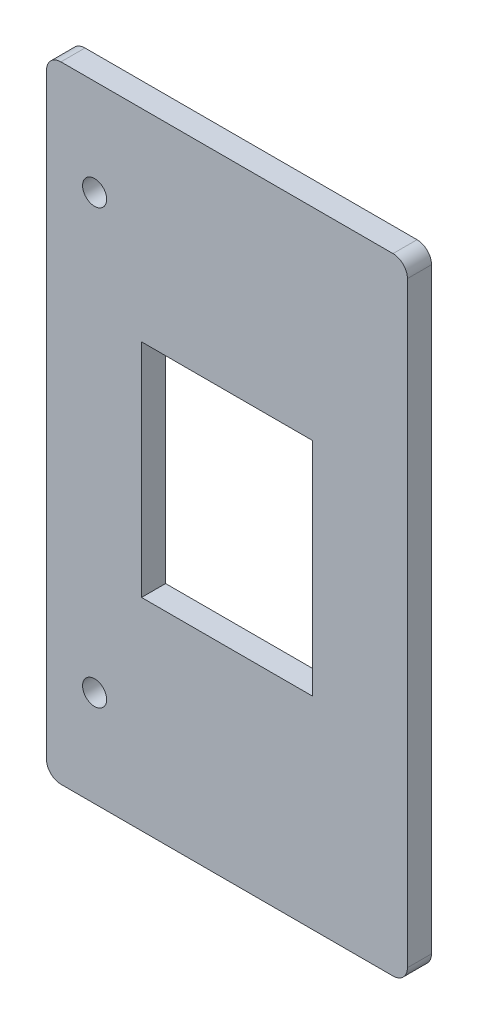
ISO-10303-21;
HEADER;
FILE_DESCRIPTION(('STEP AP214'),'2;1');
FILE_NAME('part.step','',(''),(''),'','','');
FILE_SCHEMA(('AUTOMOTIVE_DESIGN { 1 0 10303 214 1 1 1 1 }'));
ENDSEC;
DATA;
#1=APPLICATION_CONTEXT('core data for automotive mechanical design processes');
#2=APPLICATION_PROTOCOL_DEFINITION('international standard','automotive_design',2000,#1);
#3=PRODUCT_CONTEXT('',#1,'mechanical');
#4=PRODUCT('Part','Part','',(#3));
#5=PRODUCT_RELATED_PRODUCT_CATEGORY('part','',(#4));
#6=PRODUCT_DEFINITION_FORMATION('','',#4);
#7=PRODUCT_DEFINITION_CONTEXT('part definition',#1,'design');
#8=PRODUCT_DEFINITION('design','',#6,#7);
#9=PRODUCT_DEFINITION_SHAPE('','',#8);
#10=(LENGTH_UNIT() NAMED_UNIT(*) SI_UNIT(.MILLI.,.METRE.));
#11=(NAMED_UNIT(*) PLANE_ANGLE_UNIT() SI_UNIT($,.RADIAN.));
#12=(NAMED_UNIT(*) SI_UNIT($,.STERADIAN.) SOLID_ANGLE_UNIT());
#13=UNCERTAINTY_MEASURE_WITH_UNIT(LENGTH_MEASURE(1.E-05),#10,'distance_accuracy_value','');
#14=(GEOMETRIC_REPRESENTATION_CONTEXT(3) GLOBAL_UNCERTAINTY_ASSIGNED_CONTEXT((#13)) GLOBAL_UNIT_ASSIGNED_CONTEXT((#10,
#11,#12)) REPRESENTATION_CONTEXT('',''));
#15=CARTESIAN_POINT('',(0.,0.,0.));
#16=DIRECTION('',(0.,0.,1.));
#17=DIRECTION('',(1.,0.,0.));
#18=AXIS2_PLACEMENT_3D('',#15,#16,#17);
#19=CARTESIAN_POINT('',(0.,0.,5.));
#20=DIRECTION('',(0.,0.,1.));
#21=DIRECTION('',(1.,0.,0.));
#22=AXIS2_PLACEMENT_3D('',#19,#20,#21);
#23=PLANE('',#22);
#24=DIRECTION('',(1.,0.,0.));
#25=VECTOR('',#24,1.);
#26=CARTESIAN_POINT('',(-37.5,-65.,5.));
#27=LINE('',#26,#25);
#28=CARTESIAN_POINT('',(-34.5,-65.,5.));
#29=VERTEX_POINT('',#28);
#30=CARTESIAN_POINT('',(34.5,-65.,5.));
#31=VERTEX_POINT('',#30);
#32=EDGE_CURVE('E173',#29,#31,#27,.T.);
#33=ORIENTED_EDGE('',*,*,#32,.T.);
#34=CARTESIAN_POINT('',(34.5,-62.,5.));
#35=DIRECTION('',(0.,0.,1.));
#36=DIRECTION('',(1.,0.,0.));
#37=AXIS2_PLACEMENT_3D('',#34,#35,#36);
#38=CIRCLE('',#37,3.);
#39=CARTESIAN_POINT('',(37.5,-62.,5.));
#40=VERTEX_POINT('',#39);
#41=EDGE_CURVE('E222',#31,#40,#38,.T.);
#42=ORIENTED_EDGE('',*,*,#41,.T.);
#43=DIRECTION('',(0.,1.,0.));
#44=VECTOR('',#43,1.);
#45=CARTESIAN_POINT('',(37.5,65.,5.));
#46=LINE('',#45,#44);
#47=CARTESIAN_POINT('',(37.5,62.,5.));
#48=VERTEX_POINT('',#47);
#49=EDGE_CURVE('E165',#40,#48,#46,.T.);
#50=ORIENTED_EDGE('',*,*,#49,.T.);
#51=CARTESIAN_POINT('',(34.5,62.,5.));
#52=DIRECTION('',(0.,0.,1.));
#53=DIRECTION('',(1.,0.,0.));
#54=AXIS2_PLACEMENT_3D('',#51,#52,#53);
#55=CIRCLE('',#54,3.);
#56=CARTESIAN_POINT('',(34.5,65.,5.));
#57=VERTEX_POINT('',#56);
#58=EDGE_CURVE('E217',#48,#57,#55,.T.);
#59=ORIENTED_EDGE('',*,*,#58,.T.);
#60=DIRECTION('',(-1.,0.,0.));
#61=VECTOR('',#60,1.);
#62=CARTESIAN_POINT('',(-37.5,65.,5.));
#63=LINE('',#62,#61);
#64=CARTESIAN_POINT('',(-34.5,65.,5.));
#65=VERTEX_POINT('',#64);
#66=EDGE_CURVE('E168',#57,#65,#63,.T.);
#67=ORIENTED_EDGE('',*,*,#66,.T.);
#68=CARTESIAN_POINT('',(-34.5,62.,5.));
#69=DIRECTION('',(0.,0.,1.));
#70=DIRECTION('',(1.,0.,0.));
#71=AXIS2_PLACEMENT_3D('',#68,#69,#70);
#72=CIRCLE('',#71,3.);
#73=CARTESIAN_POINT('',(-37.5,62.,5.));
#74=VERTEX_POINT('',#73);
#75=EDGE_CURVE('E57',#65,#74,#72,.T.);
#76=ORIENTED_EDGE('',*,*,#75,.T.);
#77=DIRECTION('',(0.,-1.,0.));
#78=VECTOR('',#77,1.);
#79=CARTESIAN_POINT('',(-37.5,65.,5.));
#80=LINE('',#79,#78);
#81=CARTESIAN_POINT('',(-37.5,-62.,5.));
#82=VERTEX_POINT('',#81);
#83=EDGE_CURVE('E171',#74,#82,#80,.T.);
#84=ORIENTED_EDGE('',*,*,#83,.T.);
#85=CARTESIAN_POINT('',(-34.5,-62.,5.));
#86=DIRECTION('',(0.,0.,1.));
#87=DIRECTION('',(1.,0.,0.));
#88=AXIS2_PLACEMENT_3D('',#85,#86,#87);
#89=CIRCLE('',#88,3.);
#90=EDGE_CURVE('E220',#82,#29,#89,.T.);
#91=ORIENTED_EDGE('',*,*,#90,.T.);
#92=EDGE_LOOP('',(#33,#42,#50,#59,#67,#76,#84,#91));
#93=FACE_BOUND('',#92,.T.);
#94=CARTESIAN_POINT('',(-27.5,45.,5.));
#95=DIRECTION('',(0.,0.,1.));
#96=DIRECTION('',(1.,0.,0.));
#97=AXIS2_PLACEMENT_3D('',#94,#95,#96);
#98=CIRCLE('',#97,2.5);
#99=CARTESIAN_POINT('',(-25.,45.,5.));
#100=VERTEX_POINT('',#99);
#101=EDGE_CURVE('E162',#100,#100,#98,.T.);
#102=ORIENTED_EDGE('',*,*,#101,.F.);
#103=EDGE_LOOP('',(#102));
#104=FACE_BOUND('',#103,.T.);
#105=CARTESIAN_POINT('',(-27.5,-45.,5.));
#106=DIRECTION('',(0.,0.,1.));
#107=DIRECTION('',(1.,0.,0.));
#108=AXIS2_PLACEMENT_3D('',#105,#106,#107);
#109=CIRCLE('',#108,2.5);
#110=CARTESIAN_POINT('',(-25.,-45.,5.));
#111=VERTEX_POINT('',#110);
#112=EDGE_CURVE('E159',#111,#111,#109,.F.);
#113=ORIENTED_EDGE('',*,*,#112,.T.);
#114=EDGE_LOOP('',(#113));
#115=FACE_BOUND('',#114,.T.);
#116=DIRECTION('',(1.,0.,0.));
#117=VECTOR('',#116,1.);
#118=CARTESIAN_POINT('',(0.,23.,5.));
#119=LINE('',#118,#117);
#120=CARTESIAN_POINT('',(-17.75,23.,5.));
#121=VERTEX_POINT('',#120);
#122=CARTESIAN_POINT('',(17.75,23.,5.));
#123=VERTEX_POINT('',#122);
#124=EDGE_CURVE('E141',#121,#123,#119,.T.);
#125=ORIENTED_EDGE('',*,*,#124,.T.);
#126=DIRECTION('',(0.,-1.,0.));
#127=VECTOR('',#126,1.);
#128=CARTESIAN_POINT('',(17.75,0.,5.));
#129=LINE('',#128,#127);
#130=CARTESIAN_POINT('',(17.75,-23.,5.));
#131=VERTEX_POINT('',#130);
#132=EDGE_CURVE('E146',#123,#131,#129,.T.);
#133=ORIENTED_EDGE('',*,*,#132,.T.);
#134=DIRECTION('',(1.,0.,0.));
#135=VECTOR('',#134,1.);
#136=CARTESIAN_POINT('',(0.,-23.,5.));
#137=LINE('',#136,#135);
#138=CARTESIAN_POINT('',(-17.75,-23.,5.));
#139=VERTEX_POINT('',#138);
#140=EDGE_CURVE('E149',#139,#131,#137,.T.);
#141=ORIENTED_EDGE('',*,*,#140,.F.);
#142=DIRECTION('',(0.,-1.,0.));
#143=VECTOR('',#142,1.);
#144=CARTESIAN_POINT('',(-17.75,0.,5.));
#145=LINE('',#144,#143);
#146=EDGE_CURVE('E130',#121,#139,#145,.T.);
#147=ORIENTED_EDGE('',*,*,#146,.F.);
#148=EDGE_LOOP('',(#125,#133,#141,#147));
#149=FACE_BOUND('',#148,.T.);
#150=ADVANCED_FACE('F35',(#93,#104,#115,#149),#23,.T.);
#151=CARTESIAN_POINT('',(0.,0.,0.));
#152=DIRECTION('',(0.,0.,1.));
#153=DIRECTION('',(1.,0.,0.));
#154=AXIS2_PLACEMENT_3D('',#151,#152,#153);
#155=PLANE('',#154);
#156=CARTESIAN_POINT('',(-27.5,-45.,0.));
#157=DIRECTION('',(0.,0.,1.));
#158=DIRECTION('',(1.,0.,0.));
#159=AXIS2_PLACEMENT_3D('',#156,#157,#158);
#160=CIRCLE('',#159,2.5);
#161=CARTESIAN_POINT('',(-25.,-45.,0.));
#162=VERTEX_POINT('',#161);
#163=EDGE_CURVE('E181',#162,#162,#160,.F.);
#164=ORIENTED_EDGE('',*,*,#163,.F.);
#165=EDGE_LOOP('',(#164));
#166=FACE_BOUND('',#165,.T.);
#167=DIRECTION('',(0.,1.,0.));
#168=VECTOR('',#167,1.);
#169=CARTESIAN_POINT('',(37.5,65.,0.));
#170=LINE('',#169,#168);
#171=CARTESIAN_POINT('',(37.5,-62.,0.));
#172=VERTEX_POINT('',#171);
#173=CARTESIAN_POINT('',(37.5,62.,0.));
#174=VERTEX_POINT('',#173);
#175=EDGE_CURVE('E177',#172,#174,#170,.T.);
#176=ORIENTED_EDGE('',*,*,#175,.F.);
#177=CARTESIAN_POINT('',(34.5,-62.,0.));
#178=DIRECTION('',(0.,0.,1.));
#179=DIRECTION('',(1.,0.,0.));
#180=AXIS2_PLACEMENT_3D('',#177,#178,#179);
#181=CIRCLE('',#180,3.);
#182=CARTESIAN_POINT('',(34.5,-65.,0.));
#183=VERTEX_POINT('',#182);
#184=EDGE_CURVE('E210',#172,#183,#181,.F.);
#185=ORIENTED_EDGE('',*,*,#184,.T.);
#186=DIRECTION('',(1.,0.,0.));
#187=VECTOR('',#186,1.);
#188=CARTESIAN_POINT('',(-37.5,-65.,0.));
#189=LINE('',#188,#187);
#190=CARTESIAN_POINT('',(-34.5,-65.,0.));
#191=VERTEX_POINT('',#190);
#192=EDGE_CURVE('E169',#191,#183,#189,.T.);
#193=ORIENTED_EDGE('',*,*,#192,.F.);
#194=CARTESIAN_POINT('',(-34.5,-62.,0.));
#195=DIRECTION('',(0.,0.,1.));
#196=DIRECTION('',(1.,0.,0.));
#197=AXIS2_PLACEMENT_3D('',#194,#195,#196);
#198=CIRCLE('',#197,3.);
#199=CARTESIAN_POINT('',(-37.5,-62.,0.));
#200=VERTEX_POINT('',#199);
#201=EDGE_CURVE('E208',#191,#200,#198,.F.);
#202=ORIENTED_EDGE('',*,*,#201,.T.);
#203=DIRECTION('',(0.,-1.,0.));
#204=VECTOR('',#203,1.);
#205=CARTESIAN_POINT('',(-37.5,65.,0.));
#206=LINE('',#205,#204);
#207=CARTESIAN_POINT('',(-37.5,62.,0.));
#208=VERTEX_POINT('',#207);
#209=EDGE_CURVE('E184',#208,#200,#206,.T.);
#210=ORIENTED_EDGE('',*,*,#209,.F.);
#211=CARTESIAN_POINT('',(-34.5,62.,0.));
#212=DIRECTION('',(0.,0.,1.));
#213=DIRECTION('',(1.,0.,0.));
#214=AXIS2_PLACEMENT_3D('',#211,#212,#213);
#215=CIRCLE('',#214,3.);
#216=CARTESIAN_POINT('',(-34.5,65.,0.));
#217=VERTEX_POINT('',#216);
#218=EDGE_CURVE('E206',#208,#217,#215,.F.);
#219=ORIENTED_EDGE('',*,*,#218,.T.);
#220=DIRECTION('',(-1.,0.,0.));
#221=VECTOR('',#220,1.);
#222=CARTESIAN_POINT('',(-37.5,65.,0.));
#223=LINE('',#222,#221);
#224=CARTESIAN_POINT('',(34.5,65.,0.));
#225=VERTEX_POINT('',#224);
#226=EDGE_CURVE('E180',#225,#217,#223,.T.);
#227=ORIENTED_EDGE('',*,*,#226,.F.);
#228=CARTESIAN_POINT('',(34.5,62.,0.));
#229=DIRECTION('',(0.,0.,1.));
#230=DIRECTION('',(1.,0.,0.));
#231=AXIS2_PLACEMENT_3D('',#228,#229,#230);
#232=CIRCLE('',#231,3.);
#233=EDGE_CURVE('E204',#225,#174,#232,.F.);
#234=ORIENTED_EDGE('',*,*,#233,.T.);
#235=EDGE_LOOP('',(#176,#185,#193,#202,#210,#219,#227,#234));
#236=FACE_BOUND('',#235,.T.);
#237=CARTESIAN_POINT('',(-27.5,45.,0.));
#238=DIRECTION('',(0.,0.,1.));
#239=DIRECTION('',(1.,0.,0.));
#240=AXIS2_PLACEMENT_3D('',#237,#238,#239);
#241=CIRCLE('',#240,2.5);
#242=CARTESIAN_POINT('',(-25.,45.,0.));
#243=VERTEX_POINT('',#242);
#244=EDGE_CURVE('E156',#243,#243,#241,.T.);
#245=ORIENTED_EDGE('',*,*,#244,.T.);
#246=EDGE_LOOP('',(#245));
#247=FACE_BOUND('',#246,.T.);
#248=DIRECTION('',(0.,-1.,0.));
#249=VECTOR('',#248,1.);
#250=CARTESIAN_POINT('',(17.75,0.,0.));
#251=LINE('',#250,#249);
#252=CARTESIAN_POINT('',(17.75,23.,0.));
#253=VERTEX_POINT('',#252);
#254=CARTESIAN_POINT('',(17.75,-23.,0.));
#255=VERTEX_POINT('',#254);
#256=EDGE_CURVE('E197',#253,#255,#251,.T.);
#257=ORIENTED_EDGE('',*,*,#256,.F.);
#258=DIRECTION('',(1.,0.,0.));
#259=VECTOR('',#258,1.);
#260=CARTESIAN_POINT('',(0.,23.,0.));
#261=LINE('',#260,#259);
#262=CARTESIAN_POINT('',(-17.75,23.,0.));
#263=VERTEX_POINT('',#262);
#264=EDGE_CURVE('E176',#263,#253,#261,.T.);
#265=ORIENTED_EDGE('',*,*,#264,.F.);
#266=DIRECTION('',(0.,-1.,0.));
#267=VECTOR('',#266,1.);
#268=CARTESIAN_POINT('',(-17.75,0.,0.));
#269=LINE('',#268,#267);
#270=CARTESIAN_POINT('',(-17.75,-23.,0.));
#271=VERTEX_POINT('',#270);
#272=EDGE_CURVE('E133',#263,#271,#269,.T.);
#273=ORIENTED_EDGE('',*,*,#272,.T.);
#274=DIRECTION('',(1.,0.,0.));
#275=VECTOR('',#274,1.);
#276=CARTESIAN_POINT('',(0.,-23.,0.));
#277=LINE('',#276,#275);
#278=EDGE_CURVE('E194',#271,#255,#277,.T.);
#279=ORIENTED_EDGE('',*,*,#278,.T.);
#280=EDGE_LOOP('',(#257,#265,#273,#279));
#281=FACE_BOUND('',#280,.T.);
#282=ADVANCED_FACE('F238',(#166,#236,#247,#281),#155,.F.);
#283=CARTESIAN_POINT('',(37.5,65.,5.));
#284=DIRECTION('',(-1.,0.,0.));
#285=DIRECTION('',(0.,0.,1.));
#286=AXIS2_PLACEMENT_3D('',#283,#284,#285);
#287=PLANE('',#286);
#288=ORIENTED_EDGE('',*,*,#49,.F.);
#289=DIRECTION('',(0.,0.,-1.));
#290=VECTOR('',#289,1.);
#291=CARTESIAN_POINT('',(37.5,-62.,5.));
#292=LINE('',#291,#290);
#293=EDGE_CURVE('E201',#40,#172,#292,.T.);
#294=ORIENTED_EDGE('',*,*,#293,.T.);
#295=ORIENTED_EDGE('',*,*,#175,.T.);
#296=DIRECTION('',(0.,0.,-1.));
#297=VECTOR('',#296,1.);
#298=CARTESIAN_POINT('',(37.5,62.,5.));
#299=LINE('',#298,#297);
#300=EDGE_CURVE('E199',#174,#48,#299,.F.);
#301=ORIENTED_EDGE('',*,*,#300,.T.);
#302=EDGE_LOOP('',(#288,#294,#295,#301));
#303=FACE_BOUND('',#302,.T.);
#304=ADVANCED_FACE('F261',(#303),#287,.F.);
#305=CARTESIAN_POINT('',(-37.5,65.,5.));
#306=DIRECTION('',(0.,-1.,0.));
#307=DIRECTION('',(0.,0.,-1.));
#308=AXIS2_PLACEMENT_3D('',#305,#306,#307);
#309=PLANE('',#308);
#310=ORIENTED_EDGE('',*,*,#226,.T.);
#311=DIRECTION('',(0.,0.,-1.));
#312=VECTOR('',#311,1.);
#313=CARTESIAN_POINT('',(-34.5,65.,5.));
#314=LINE('',#313,#312);
#315=EDGE_CURVE('E11',#217,#65,#314,.F.);
#316=ORIENTED_EDGE('',*,*,#315,.T.);
#317=ORIENTED_EDGE('',*,*,#66,.F.);
#318=DIRECTION('',(0.,0.,-1.));
#319=VECTOR('',#318,1.);
#320=CARTESIAN_POINT('',(34.5,65.,5.));
#321=LINE('',#320,#319);
#322=EDGE_CURVE('E43',#57,#225,#321,.T.);
#323=ORIENTED_EDGE('',*,*,#322,.T.);
#324=EDGE_LOOP('',(#310,#316,#317,#323));
#325=FACE_BOUND('',#324,.T.);
#326=ADVANCED_FACE('F232',(#325),#309,.F.);
#327=CARTESIAN_POINT('',(-37.5,65.,5.));
#328=DIRECTION('',(1.,0.,0.));
#329=DIRECTION('',(0.,0.,-1.));
#330=AXIS2_PLACEMENT_3D('',#327,#328,#329);
#331=PLANE('',#330);
#332=ORIENTED_EDGE('',*,*,#209,.T.);
#333=DIRECTION('',(0.,0.,-1.));
#334=VECTOR('',#333,1.);
#335=CARTESIAN_POINT('',(-37.5,-62.,5.));
#336=LINE('',#335,#334);
#337=EDGE_CURVE('E50',#200,#82,#336,.F.);
#338=ORIENTED_EDGE('',*,*,#337,.T.);
#339=ORIENTED_EDGE('',*,*,#83,.F.);
#340=DIRECTION('',(0.,0.,-1.));
#341=VECTOR('',#340,1.);
#342=CARTESIAN_POINT('',(-37.5,62.,5.));
#343=LINE('',#342,#341);
#344=EDGE_CURVE('E224',#74,#208,#343,.T.);
#345=ORIENTED_EDGE('',*,*,#344,.T.);
#346=EDGE_LOOP('',(#332,#338,#339,#345));
#347=FACE_BOUND('',#346,.T.);
#348=ADVANCED_FACE('F244',(#347),#331,.F.);
#349=CARTESIAN_POINT('',(-37.5,-65.,5.));
#350=DIRECTION('',(0.,1.,0.));
#351=DIRECTION('',(0.,0.,1.));
#352=AXIS2_PLACEMENT_3D('',#349,#350,#351);
#353=PLANE('',#352);
#354=ORIENTED_EDGE('',*,*,#192,.T.);
#355=DIRECTION('',(0.,0.,-1.));
#356=VECTOR('',#355,1.);
#357=CARTESIAN_POINT('',(34.5,-65.,5.));
#358=LINE('',#357,#356);
#359=EDGE_CURVE('E215',#183,#31,#358,.F.);
#360=ORIENTED_EDGE('',*,*,#359,.T.);
#361=ORIENTED_EDGE('',*,*,#32,.F.);
#362=DIRECTION('',(0.,0.,-1.));
#363=VECTOR('',#362,1.);
#364=CARTESIAN_POINT('',(-34.5,-65.,5.));
#365=LINE('',#364,#363);
#366=EDGE_CURVE('E212',#29,#191,#365,.T.);
#367=ORIENTED_EDGE('',*,*,#366,.T.);
#368=EDGE_LOOP('',(#354,#360,#361,#367));
#369=FACE_BOUND('',#368,.T.);
#370=ADVANCED_FACE('F253',(#369),#353,.F.);
#371=CARTESIAN_POINT('',(-27.5,45.,-5.));
#372=DIRECTION('',(0.,0.,1.));
#373=DIRECTION('',(1.,0.,0.));
#374=AXIS2_PLACEMENT_3D('',#371,#372,#373);
#375=CYLINDRICAL_SURFACE('',#374,2.5);
#376=ORIENTED_EDGE('',*,*,#101,.T.);
#377=EDGE_LOOP('',(#376));
#378=FACE_BOUND('',#377,.T.);
#379=ORIENTED_EDGE('',*,*,#244,.F.);
#380=EDGE_LOOP('',(#379));
#381=FACE_BOUND('',#380,.T.);
#382=ADVANCED_FACE('F275',(#378,#381),#375,.F.);
#383=CARTESIAN_POINT('',(-27.5,-45.,-5.));
#384=DIRECTION('',(0.,0.,1.));
#385=DIRECTION('',(1.,0.,0.));
#386=AXIS2_PLACEMENT_3D('',#383,#384,#385);
#387=CYLINDRICAL_SURFACE('',#386,2.5);
#388=ORIENTED_EDGE('',*,*,#112,.F.);
#389=EDGE_LOOP('',(#388));
#390=FACE_BOUND('',#389,.T.);
#391=ORIENTED_EDGE('',*,*,#163,.T.);
#392=EDGE_LOOP('',(#391));
#393=FACE_BOUND('',#392,.T.);
#394=ADVANCED_FACE('F342',(#390,#393),#387,.F.);
#395=CARTESIAN_POINT('',(17.75,0.,-5.));
#396=DIRECTION('',(-1.,0.,0.));
#397=DIRECTION('',(0.,0.,1.));
#398=AXIS2_PLACEMENT_3D('',#395,#396,#397);
#399=PLANE('',#398);
#400=ORIENTED_EDGE('',*,*,#256,.T.);
#401=DIRECTION('',(0.,0.,1.));
#402=VECTOR('',#401,1.);
#403=CARTESIAN_POINT('',(17.75,-23.,-5.));
#404=LINE('',#403,#402);
#405=EDGE_CURVE('E154',#255,#131,#404,.T.);
#406=ORIENTED_EDGE('',*,*,#405,.T.);
#407=ORIENTED_EDGE('',*,*,#132,.F.);
#408=DIRECTION('',(0.,0.,1.));
#409=VECTOR('',#408,1.);
#410=CARTESIAN_POINT('',(17.75,23.,-5.));
#411=LINE('',#410,#409);
#412=EDGE_CURVE('E137',#253,#123,#411,.T.);
#413=ORIENTED_EDGE('',*,*,#412,.F.);
#414=EDGE_LOOP('',(#400,#406,#407,#413));
#415=FACE_BOUND('',#414,.T.);
#416=ADVANCED_FACE('F333',(#415),#399,.T.);
#417=CARTESIAN_POINT('',(0.,-23.,-5.));
#418=DIRECTION('',(0.,-1.,0.));
#419=DIRECTION('',(0.,0.,-1.));
#420=AXIS2_PLACEMENT_3D('',#417,#418,#419);
#421=PLANE('',#420);
#422=DIRECTION('',(0.,0.,1.));
#423=VECTOR('',#422,1.);
#424=CARTESIAN_POINT('',(-17.75,-23.,-5.));
#425=LINE('',#424,#423);
#426=EDGE_CURVE('E136',#271,#139,#425,.T.);
#427=ORIENTED_EDGE('',*,*,#426,.T.);
#428=ORIENTED_EDGE('',*,*,#140,.T.);
#429=ORIENTED_EDGE('',*,*,#405,.F.);
#430=ORIENTED_EDGE('',*,*,#278,.F.);
#431=EDGE_LOOP('',(#427,#428,#429,#430));
#432=FACE_BOUND('',#431,.T.);
#433=ADVANCED_FACE('F325',(#432),#421,.F.);
#434=CARTESIAN_POINT('',(-17.75,0.,-5.));
#435=DIRECTION('',(-1.,0.,0.));
#436=DIRECTION('',(0.,0.,1.));
#437=AXIS2_PLACEMENT_3D('',#434,#435,#436);
#438=PLANE('',#437);
#439=DIRECTION('',(0.,0.,1.));
#440=VECTOR('',#439,1.);
#441=CARTESIAN_POINT('',(-17.75,23.,-5.));
#442=LINE('',#441,#440);
#443=EDGE_CURVE('E125',#263,#121,#442,.T.);
#444=ORIENTED_EDGE('',*,*,#443,.T.);
#445=ORIENTED_EDGE('',*,*,#146,.T.);
#446=ORIENTED_EDGE('',*,*,#426,.F.);
#447=ORIENTED_EDGE('',*,*,#272,.F.);
#448=EDGE_LOOP('',(#444,#445,#446,#447));
#449=FACE_BOUND('',#448,.T.);
#450=ADVANCED_FACE('F127',(#449),#438,.F.);
#451=CARTESIAN_POINT('',(0.,23.,-5.));
#452=DIRECTION('',(0.,-1.,0.));
#453=DIRECTION('',(0.,0.,-1.));
#454=AXIS2_PLACEMENT_3D('',#451,#452,#453);
#455=PLANE('',#454);
#456=ORIENTED_EDGE('',*,*,#264,.T.);
#457=ORIENTED_EDGE('',*,*,#412,.T.);
#458=ORIENTED_EDGE('',*,*,#124,.F.);
#459=ORIENTED_EDGE('',*,*,#443,.F.);
#460=EDGE_LOOP('',(#456,#457,#458,#459));
#461=FACE_BOUND('',#460,.T.);
#462=ADVANCED_FACE('F142',(#461),#455,.T.);
#463=CARTESIAN_POINT('',(34.5,-62.,5.));
#464=DIRECTION('',(0.,0.,-1.));
#465=DIRECTION('',(-1.,0.,0.));
#466=AXIS2_PLACEMENT_3D('',#463,#464,#465);
#467=CYLINDRICAL_SURFACE('',#466,3.);
#468=ORIENTED_EDGE('',*,*,#41,.F.);
#469=ORIENTED_EDGE('',*,*,#359,.F.);
#470=ORIENTED_EDGE('',*,*,#184,.F.);
#471=ORIENTED_EDGE('',*,*,#293,.F.);
#472=EDGE_LOOP('',(#468,#469,#470,#471));
#473=FACE_BOUND('',#472,.T.);
#474=ADVANCED_FACE('F258',(#473),#467,.T.);
#475=CARTESIAN_POINT('',(-34.5,-62.,5.));
#476=DIRECTION('',(0.,0.,-1.));
#477=DIRECTION('',(-1.,0.,0.));
#478=AXIS2_PLACEMENT_3D('',#475,#476,#477);
#479=CYLINDRICAL_SURFACE('',#478,3.);
#480=ORIENTED_EDGE('',*,*,#90,.F.);
#481=ORIENTED_EDGE('',*,*,#337,.F.);
#482=ORIENTED_EDGE('',*,*,#201,.F.);
#483=ORIENTED_EDGE('',*,*,#366,.F.);
#484=EDGE_LOOP('',(#480,#481,#482,#483));
#485=FACE_BOUND('',#484,.T.);
#486=ADVANCED_FACE('F250',(#485),#479,.T.);
#487=CARTESIAN_POINT('',(-34.5,62.,5.));
#488=DIRECTION('',(0.,0.,-1.));
#489=DIRECTION('',(-1.,0.,0.));
#490=AXIS2_PLACEMENT_3D('',#487,#488,#489);
#491=CYLINDRICAL_SURFACE('',#490,3.);
#492=ORIENTED_EDGE('',*,*,#75,.F.);
#493=ORIENTED_EDGE('',*,*,#315,.F.);
#494=ORIENTED_EDGE('',*,*,#218,.F.);
#495=ORIENTED_EDGE('',*,*,#344,.F.);
#496=EDGE_LOOP('',(#492,#493,#494,#495));
#497=FACE_BOUND('',#496,.T.);
#498=ADVANCED_FACE('F243',(#497),#491,.T.);
#499=CARTESIAN_POINT('',(34.5,62.,5.));
#500=DIRECTION('',(0.,0.,-1.));
#501=DIRECTION('',(-1.,0.,0.));
#502=AXIS2_PLACEMENT_3D('',#499,#500,#501);
#503=CYLINDRICAL_SURFACE('',#502,3.);
#504=ORIENTED_EDGE('',*,*,#58,.F.);
#505=ORIENTED_EDGE('',*,*,#300,.F.);
#506=ORIENTED_EDGE('',*,*,#233,.F.);
#507=ORIENTED_EDGE('',*,*,#322,.F.);
#508=EDGE_LOOP('',(#504,#505,#506,#507));
#509=FACE_BOUND('',#508,.T.);
#510=ADVANCED_FACE('F37',(#509),#503,.T.);
#511=CLOSED_SHELL('',(#150,#282,#304,#326,#348,#370,#382,#394,#416,#433,#450,#462,#474,#486,
#498,#510));
#512=MANIFOLD_SOLID_BREP('B2',#511);
#513=ADVANCED_BREP_SHAPE_REPRESENTATION('',(#18,#512),#14);
#514=SHAPE_DEFINITION_REPRESENTATION(#9,#513);
ENDSEC;
END-ISO-10303-21;
